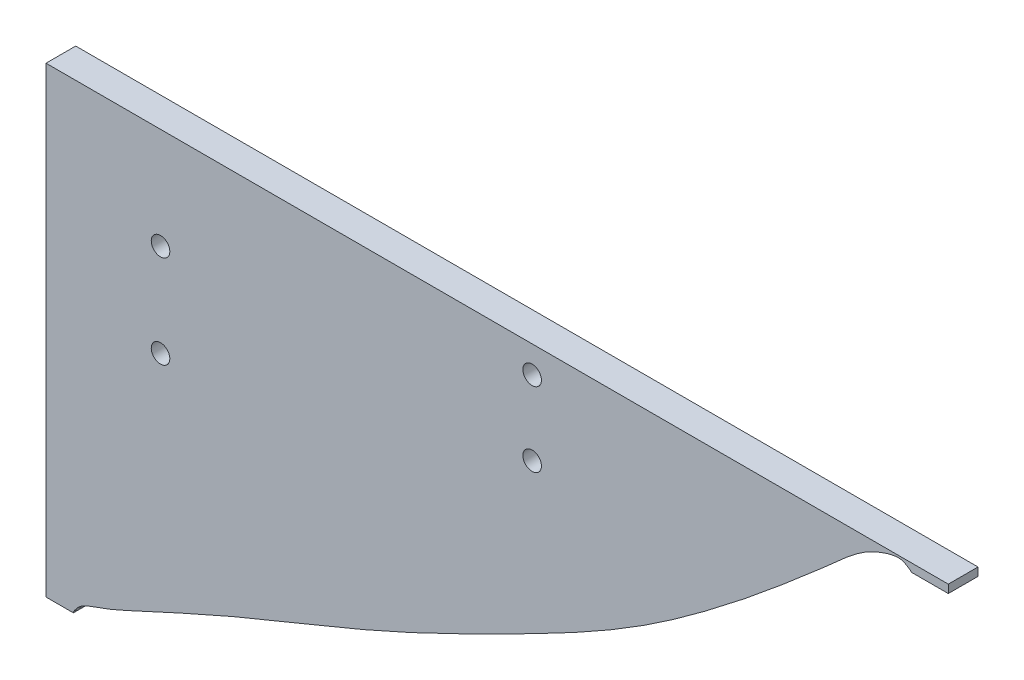
ISO-10303-21;
HEADER;
FILE_DESCRIPTION(('STEP AP214'),'2;1');
FILE_NAME('part.step','',(''),(''),'','','');
FILE_SCHEMA(('AUTOMOTIVE_DESIGN { 1 0 10303 214 1 1 1 1 }'));
ENDSEC;
DATA;
#1=APPLICATION_CONTEXT('core data for automotive mechanical design processes');
#2=APPLICATION_PROTOCOL_DEFINITION('international standard','automotive_design',2000,#1);
#3=PRODUCT_CONTEXT('',#1,'mechanical');
#4=PRODUCT('Part','Part','',(#3));
#5=PRODUCT_RELATED_PRODUCT_CATEGORY('part','',(#4));
#6=PRODUCT_DEFINITION_FORMATION('','',#4);
#7=PRODUCT_DEFINITION_CONTEXT('part definition',#1,'design');
#8=PRODUCT_DEFINITION('design','',#6,#7);
#9=PRODUCT_DEFINITION_SHAPE('','',#8);
#10=(LENGTH_UNIT() NAMED_UNIT(*) SI_UNIT(.MILLI.,.METRE.));
#11=(NAMED_UNIT(*) PLANE_ANGLE_UNIT() SI_UNIT($,.RADIAN.));
#12=(NAMED_UNIT(*) SI_UNIT($,.STERADIAN.) SOLID_ANGLE_UNIT());
#13=UNCERTAINTY_MEASURE_WITH_UNIT(LENGTH_MEASURE(1.E-05),#10,'distance_accuracy_value','');
#14=(GEOMETRIC_REPRESENTATION_CONTEXT(3) GLOBAL_UNCERTAINTY_ASSIGNED_CONTEXT((#13)) GLOBAL_UNIT_ASSIGNED_CONTEXT((#10,
#11,#12)) REPRESENTATION_CONTEXT('',''));
#15=CARTESIAN_POINT('',(0.,0.,0.));
#16=DIRECTION('',(0.,0.,1.));
#17=DIRECTION('',(1.,0.,0.));
#18=AXIS2_PLACEMENT_3D('',#15,#16,#17);
#19=CARTESIAN_POINT('',(-127.147291570498,-122.242162943717,116.));
#20=DIRECTION('',(0.,0.,-1.));
#21=DIRECTION('',(-1.,0.,0.));
#22=AXIS2_PLACEMENT_3D('',#19,#20,#21);
#23=PLANE('',#22);
#24=CARTESIAN_POINT('',(-100.,-50.,116.));
#25=DIRECTION('',(0.,0.,-1.));
#26=DIRECTION('',(-1.,0.,0.));
#27=AXIS2_PLACEMENT_3D('',#24,#25,#26);
#28=CIRCLE('',#27,2.5);
#29=CARTESIAN_POINT('',(-102.5,-50.,116.));
#30=VERTEX_POINT('',#29);
#31=EDGE_CURVE('E207',#30,#30,#28,.F.);
#32=ORIENTED_EDGE('',*,*,#31,.F.);
#33=EDGE_LOOP('',(#32));
#34=FACE_BOUND('',#33,.T.);
#35=CARTESIAN_POINT('',(0.0705666698621599,-4.96037406111782,116.));
#36=DIRECTION('',(0.,0.,-1.));
#37=DIRECTION('',(-1.,0.,0.));
#38=AXIS2_PLACEMENT_3D('',#35,#36,#37);
#39=CIRCLE('',#38,2.5);
#40=CARTESIAN_POINT('',(-2.42943333013784,-4.96037406111782,116.));
#41=VERTEX_POINT('',#40);
#42=EDGE_CURVE('E203',#41,#41,#39,.F.);
#43=ORIENTED_EDGE('',*,*,#42,.F.);
#44=EDGE_LOOP('',(#43));
#45=FACE_BOUND('',#44,.T.);
#46=CARTESIAN_POINT('',(-123.458051920499,-122.239231143203,116.));
#47=CARTESIAN_POINT('',(-125.917545011529,-122.241196913194,116.));
#48=CARTESIAN_POINT('',(-128.377038121611,-122.243138904534,116.));
#49=CARTESIAN_POINT('',(-130.836531244067,-122.245064953348,116.));
#50=B_SPLINE_CURVE_WITH_KNOTS('',3,(#46,#47,#48,#49),.UNSPECIFIED.,.F.,.F.,(4,4),(0.,1.),.UNSPECIFIED.);
#51=CARTESIAN_POINT('',(-130.836531244067,-122.245064953348,116.));
#52=VERTEX_POINT('',#51);
#53=CARTESIAN_POINT('',(-123.458051920499,-122.239231143203,116.));
#54=VERTEX_POINT('',#53);
#55=EDGE_CURVE('E161',#52,#54,#50,.F.);
#56=ORIENTED_EDGE('',*,*,#55,.T.);
#57=CARTESIAN_POINT('',(102.185345036779,0.050501234881916,116.));
#58=CARTESIAN_POINT('',(102.143745349932,0.126282884014848,116.));
#59=CARTESIAN_POINT('',(102.090021150855,0.196170965768959,116.));
#60=CARTESIAN_POINT('',(101.969436927359,0.319138158462939,116.));
#61=CARTESIAN_POINT('',(101.90185150842,0.374024602398633,116.));
#62=CARTESIAN_POINT('',(101.691728117572,0.527497028765685,116.));
#63=CARTESIAN_POINT('',(101.543963902861,0.617815117095939,116.));
#64=CARTESIAN_POINT('',(101.250952529474,0.802382165353212,116.));
#65=CARTESIAN_POINT('',(101.106564648327,0.897973053941049,116.));
#66=CARTESIAN_POINT('',(100.812997731568,1.08167251338324,116.));
#67=CARTESIAN_POINT('',(100.663092856788,1.16969331026808,116.));
#68=CARTESIAN_POINT('',(100.35814206929,1.33127826092675,116.));
#69=CARTESIAN_POINT('',(100.203147888116,1.40486745874551,116.));
#70=CARTESIAN_POINT('',(99.8834987997031,1.52441792114301,116.));
#71=CARTESIAN_POINT('',(99.7189856179253,1.57078449496892,116.));
#72=CARTESIAN_POINT('',(99.381219642386,1.63852392943911,116.));
#73=CARTESIAN_POINT('',(99.2067886348991,1.65986740854222,116.));
#74=CARTESIAN_POINT('',(98.862192139404,1.68212402659577,116.));
#75=CARTESIAN_POINT('',(98.6907385145854,1.68341684615452,116.));
#76=CARTESIAN_POINT('',(98.1781310954065,1.66687661819945,116.));
#77=CARTESIAN_POINT('',(97.8387499509134,1.62840136633339,116.));
#78=CARTESIAN_POINT('',(97.1622460551872,1.52515225956688,116.));
#79=CARTESIAN_POINT('',(96.8245343617113,1.45788547518486,116.));
#80=CARTESIAN_POINT('',(95.8207026316839,1.21663732005597,116.));
#81=CARTESIAN_POINT('',(95.1658503428321,1.00874959833609,116.));
#82=CARTESIAN_POINT('',(93.870659069786,0.545445519335014,116.));
#83=CARTESIAN_POINT('',(93.2354848974096,0.287051757659186,116.));
#84=CARTESIAN_POINT('',(91.995707034373,-0.26970774245057,116.));
#85=CARTESIAN_POINT('',(91.3892460824492,-0.568625422063785,116.));
#86=CARTESIAN_POINT('',(90.2030389733848,-1.20732073118557,116.));
#87=CARTESIAN_POINT('',(89.6234372801556,-1.54731931646892,116.));
#88=CARTESIAN_POINT('',(88.4915687955719,-2.26912488309681,116.));
#89=CARTESIAN_POINT('',(87.9394637325724,-2.65117922597023,116.));
#90=CARTESIAN_POINT('',(86.3147313850487,-3.84564782199919,116.));
#91=CARTESIAN_POINT('',(85.2735731207714,-4.70619355439569,116.));
#92=CARTESIAN_POINT('',(83.2252662085998,-6.47930230895787,116.));
#93=CARTESIAN_POINT('',(82.2185294791051,-7.39142836707141,116.));
#94=CARTESIAN_POINT('',(80.1939705981187,-9.19925463389272,116.));
#95=CARTESIAN_POINT('',(79.1777487698858,-10.0986552179806,116.));
#96=CARTESIAN_POINT('',(77.1264611270884,-11.8758871181459,116.));
#97=CARTESIAN_POINT('',(76.0911317363368,-12.7534177083032,116.));
#98=CARTESIAN_POINT('',(74.0164254108522,-14.5038419680243,116.));
#99=CARTESIAN_POINT('',(72.9792610716652,-15.3792729114846,116.));
#100=CARTESIAN_POINT('',(70.9298028259996,-17.1589552964569,116.));
#101=CARTESIAN_POINT('',(69.9142921010426,-18.0594790058551,116.));
#102=CARTESIAN_POINT('',(67.8646878768501,-19.8389922271503,116.));
#103=CARTESIAN_POINT('',(66.8296633927954,-20.7167304284747,116.));
#104=CARTESIAN_POINT('',(64.7507484383428,-22.4614612861034,116.));
#105=CARTESIAN_POINT('',(63.7080308601868,-23.329934736966,116.));
#106=CARTESIAN_POINT('',(58.4774582845353,-27.652025312593,116.));
#107=CARTESIAN_POINT('',(54.2223472944778,-31.0260193511005,116.));
#108=CARTESIAN_POINT('',(47.7568208587066,-35.9675165786623,116.));
#109=CARTESIAN_POINT('',(45.5874373784499,-37.5945883155184,116.));
#110=CARTESIAN_POINT('',(41.2140181909527,-40.799724049673,116.));
#111=CARTESIAN_POINT('',(39.0094266361723,-42.3770019263137,116.));
#112=CARTESIAN_POINT('',(34.5486967430989,-45.45865641,116.));
#113=CARTESIAN_POINT('',(32.293587444536,-46.9644883610587,116.));
#114=CARTESIAN_POINT('',(27.7320874646265,-49.9036263429001,116.));
#115=CARTESIAN_POINT('',(25.4241743765563,-51.33763013415,116.));
#116=CARTESIAN_POINT('',(20.7677661619923,-54.1312823015686,116.));
#117=CARTESIAN_POINT('',(18.4193127756458,-55.4909221274922,116.));
#118=CARTESIAN_POINT('',(13.6881990605754,-58.1473833366058,116.));
#119=CARTESIAN_POINT('',(11.3055607799984,-59.4442452095373,116.));
#120=CARTESIAN_POINT('',(6.51660243792351,-61.9944791695494,116.));
#121=CARTESIAN_POINT('',(4.11056529690311,-63.2483708185253,116.));
#122=CARTESIAN_POINT('',(-0.709901700973838,-65.7407415334606,116.));
#123=CARTESIAN_POINT('',(-3.12500143561241,-66.9779904199252,116.));
#124=CARTESIAN_POINT('',(-10.3856486991802,-70.6615515374579,116.));
#125=CARTESIAN_POINT('',(-15.2427175398577,-73.081213562781,116.));
#126=CARTESIAN_POINT('',(-24.9936617622751,-77.837659184411,116.));
#127=CARTESIAN_POINT('',(-29.8877650728106,-80.1744152819605,116.));
#128=CARTESIAN_POINT('',(-37.2827989415143,-83.5596333145429,116.));
#129=CARTESIAN_POINT('',(-39.7577998209799,-84.6658058957321,116.));
#130=CARTESIAN_POINT('',(-44.7291972754296,-86.8305315165229,116.));
#131=CARTESIAN_POINT('',(-47.2248287239943,-87.8907874673155,116.));
#132=CARTESIAN_POINT('',(-54.7305215827917,-91.0297162228649,116.));
#133=CARTESIAN_POINT('',(-59.7598500463873,-93.0655071195247,116.));
#134=CARTESIAN_POINT('',(-69.8106978110577,-97.1544694527341,116.));
#135=CARTESIAN_POINT('',(-74.8309952591007,-99.2096397295397,116.));
#136=CARTESIAN_POINT('',(-84.8113629379097,-103.461861537504,116.));
#137=CARTESIAN_POINT('',(-89.7687044749324,-105.66567392611,116.));
#138=CARTESIAN_POINT('',(-97.1769308519184,-109.031772943947,116.));
#139=CARTESIAN_POINT('',(-99.6417859260494,-110.1638227246,116.));
#140=CARTESIAN_POINT('',(-103.337785946255,-111.864632044421,116.));
#141=CARTESIAN_POINT('',(-104.569714817283,-112.431723356779,116.));
#142=CARTESIAN_POINT('',(-107.034353984342,-113.564204573108,116.));
#143=CARTESIAN_POINT('',(-108.266016475275,-114.131945714388,116.));
#144=CARTESIAN_POINT('',(-110.736567108815,-115.251305752162,116.));
#145=CARTESIAN_POINT('',(-111.977221460794,-115.800163082338,116.));
#146=CARTESIAN_POINT('',(-113.855728193572,-116.579265004338,116.));
#147=CARTESIAN_POINT('',(-114.48476765908,-116.831597669714,116.));
#148=CARTESIAN_POINT('',(-115.751244101855,-117.314708747659,116.));
#149=CARTESIAN_POINT('',(-116.389780655786,-117.542664829749,116.));
#150=CARTESIAN_POINT('',(-117.67165600791,-117.986250868068,116.));
#151=CARTESIAN_POINT('',(-118.313411152534,-118.205945655686,116.));
#152=CARTESIAN_POINT('',(-119.262221286969,-118.570966851158,116.));
#153=CARTESIAN_POINT('',(-119.576462069353,-118.697849177697,116.));
#154=CARTESIAN_POINT('',(-120.196857346799,-118.972369250501,116.));
#155=CARTESIAN_POINT('',(-120.504121011376,-119.120447972246,116.));
#156=CARTESIAN_POINT('',(-121.095592759326,-119.449584033694,116.));
#157=CARTESIAN_POINT('',(-121.380303340259,-119.630761690681,116.));
#158=CARTESIAN_POINT('',(-121.915930532508,-120.044027688222,116.));
#159=CARTESIAN_POINT('',(-122.165530639422,-120.281213246816,116.));
#160=CARTESIAN_POINT('',(-122.618207207597,-120.786374644734,116.));
#161=CARTESIAN_POINT('',(-122.825015212994,-121.05474960064,116.));
#162=CARTESIAN_POINT('',(-123.11963290276,-121.469923256004,116.));
#163=CARTESIAN_POINT('',(-123.217963014272,-121.609674035666,116.));
#164=CARTESIAN_POINT('',(-123.342884404126,-121.832447477953,116.));
#165=CARTESIAN_POINT('',(-123.380001259822,-121.908782181737,116.));
#166=CARTESIAN_POINT('',(-123.436207004498,-122.069728633116,116.));
#167=CARTESIAN_POINT('',(-123.454774335715,-122.154391049123,116.));
#168=CARTESIAN_POINT('',(-123.458051920499,-122.239231143203,116.));
#169=B_SPLINE_CURVE_WITH_KNOTS('',3,(#57,#58,#59,#60,#61,#62,#63,#64,#65,#66,#67,#68,#69,#70,
#71,#72,#73,#74,#75,#76,#77,#78,#79,#80,#81,#82,#83,#84,#85,#86,#87,#88,#89,#90,#91,#92,#93,#94,
#95,#96,#97,#98,#99,#100,#101,#102,#103,#104,#105,#106,#107,#108,#109,#110,#111,#112,#113,#114,
#115,#116,#117,#118,#119,#120,#121,#122,#123,#124,#125,#126,#127,#128,#129,#130,#131,#132,#133,
#134,#135,#136,#137,#138,#139,#140,#141,#142,#143,#144,#145,#146,#147,#148,#149,#150,#151,#152,
#153,#154,#155,#156,#157,#158,#159,#160,#161,#162,#163,#164,#165,#166,#167,#168),.UNSPECIFIED.,
.F.,.F.,(4,2,2,2,2,2,2,2,2,2,2,2,2,2,2,2,2,2,2,2,2,2,2,2,2,2,2,2,2,2,2,2,2,2,2,2,2,2,2,2,2,2,2,
2,2,2,2,2,2,2,2,2,2,2,2,4),(0.,0.000976562499999889,0.00195312499999978,0.00390624999999989,
0.00585937499999989,0.0078125,0.009765625,0.01171875,0.0136718750000001,0.0156250000000001,
0.01953125,0.0234374999999999,0.0312499999999999,0.0390624999999998,0.0468749999999998,
0.0546874999999998,0.0624999999999997,0.0781249999999996,0.0937499999999996,0.109374999999999,
0.124999999999999,0.140624999999999,0.156249999999999,0.171874999999999,0.187499999999999,
0.249999999999999,0.281249999999999,0.3125,0.34375,0.375,0.40625,0.437499999999999,
0.468749999999999,0.499999999999999,0.562499999999999,0.624999999999999,0.656249999999999,
0.687499999999999,0.75,0.8125,0.875,0.90625,0.921875,0.9375,0.953125,0.9609375,0.96875,
0.9765625,0.98046875,0.984375,0.98828125,0.9921875,0.99609375,0.998046875,0.9990234375,1.),.UNSPECIFIED.);
#170=CARTESIAN_POINT('',(102.185345036779,0.050501234881916,116.));
#171=VERTEX_POINT('',#170);
#172=EDGE_CURVE('E88',#54,#171,#169,.F.);
#173=ORIENTED_EDGE('',*,*,#172,.T.);
#174=DIRECTION('',(0.999999999820266,1.89596216249227E-05,0.));
#175=VECTOR('',#174,1.);
#176=CARTESIAN_POINT('',(102.185345036779,0.0505012348819037,116.));
#177=LINE('',#176,#175);
#178=CARTESIAN_POINT('',(112.12090684944,0.0506896093745366,116.));
#179=VERTEX_POINT('',#178);
#180=EDGE_CURVE('E102',#171,#179,#177,.T.);
#181=ORIENTED_EDGE('',*,*,#180,.T.);
#182=DIRECTION('',(0.,1.,0.));
#183=VECTOR('',#182,1.);
#184=CARTESIAN_POINT('',(112.12090684944,2.25600000000004,116.));
#185=LINE('',#184,#183);
#186=CARTESIAN_POINT('',(112.12090684944,2.25600000000004,116.));
#187=VERTEX_POINT('',#186);
#188=EDGE_CURVE('E96',#179,#187,#185,.T.);
#189=ORIENTED_EDGE('',*,*,#188,.T.);
#190=DIRECTION('',(-1.,0.,0.));
#191=VECTOR('',#190,1.);
#192=CARTESIAN_POINT('',(112.12090684944,2.25600000000004,116.));
#193=LINE('',#192,#191);
#194=CARTESIAN_POINT('',(-130.836531244067,2.25600000000001,116.));
#195=VERTEX_POINT('',#194);
#196=EDGE_CURVE('E100',#187,#195,#193,.T.);
#197=ORIENTED_EDGE('',*,*,#196,.T.);
#198=DIRECTION('',(0.,-1.,0.));
#199=VECTOR('',#198,1.);
#200=CARTESIAN_POINT('',(-130.836531244067,-122.245064953348,116.));
#201=LINE('',#200,#199);
#202=EDGE_CURVE('E51',#195,#52,#201,.T.);
#203=ORIENTED_EDGE('',*,*,#202,.T.);
#204=EDGE_LOOP('',(#56,#173,#181,#189,#197,#203));
#205=FACE_BOUND('',#204,.T.);
#206=CARTESIAN_POINT('',(0.0705666698621599,-25.,116.));
#207=DIRECTION('',(0.,0.,-1.));
#208=DIRECTION('',(-1.,0.,0.));
#209=AXIS2_PLACEMENT_3D('',#206,#207,#208);
#210=CIRCLE('',#209,2.5);
#211=CARTESIAN_POINT('',(-2.42943333013784,-25.,116.));
#212=VERTEX_POINT('',#211);
#213=EDGE_CURVE('E204',#212,#212,#210,.F.);
#214=ORIENTED_EDGE('',*,*,#213,.F.);
#215=EDGE_LOOP('',(#214));
#216=FACE_BOUND('',#215,.T.);
#217=CARTESIAN_POINT('',(-100.,-25.,116.));
#218=DIRECTION('',(0.,0.,-1.));
#219=DIRECTION('',(-1.,0.,0.));
#220=AXIS2_PLACEMENT_3D('',#217,#218,#219);
#221=CIRCLE('',#220,2.5);
#222=CARTESIAN_POINT('',(-102.5,-25.,116.));
#223=VERTEX_POINT('',#222);
#224=EDGE_CURVE('E210',#223,#223,#221,.F.);
#225=ORIENTED_EDGE('',*,*,#224,.F.);
#226=EDGE_LOOP('',(#225));
#227=FACE_BOUND('',#226,.T.);
#228=ADVANCED_FACE('F30',(#34,#45,#205,#216,#227),#23,.F.);
#229=CARTESIAN_POINT('',(-127.147291570498,-122.242162943717,108.));
#230=DIRECTION('',(0.,0.,-1.));
#231=DIRECTION('',(-1.,0.,0.));
#232=AXIS2_PLACEMENT_3D('',#229,#230,#231);
#233=PLANE('',#232);
#234=CARTESIAN_POINT('',(-100.,-50.,108.));
#235=DIRECTION('',(0.,0.,-1.));
#236=DIRECTION('',(-1.,0.,0.));
#237=AXIS2_PLACEMENT_3D('',#234,#235,#236);
#238=CIRCLE('',#237,2.5);
#239=CARTESIAN_POINT('',(-102.5,-50.,108.));
#240=VERTEX_POINT('',#239);
#241=EDGE_CURVE('E208',#240,#240,#238,.F.);
#242=ORIENTED_EDGE('',*,*,#241,.T.);
#243=EDGE_LOOP('',(#242));
#244=FACE_BOUND('',#243,.T.);
#245=CARTESIAN_POINT('',(0.0705666698621599,-4.96037406111782,108.));
#246=DIRECTION('',(0.,0.,-1.));
#247=DIRECTION('',(-1.,0.,0.));
#248=AXIS2_PLACEMENT_3D('',#245,#246,#247);
#249=CIRCLE('',#248,2.5);
#250=CARTESIAN_POINT('',(-2.42943333013784,-4.96037406111782,108.));
#251=VERTEX_POINT('',#250);
#252=EDGE_CURVE('E200',#251,#251,#249,.F.);
#253=ORIENTED_EDGE('',*,*,#252,.T.);
#254=EDGE_LOOP('',(#253));
#255=FACE_BOUND('',#254,.T.);
#256=CARTESIAN_POINT('',(-130.836531244067,-122.245064953348,108.));
#257=CARTESIAN_POINT('',(-128.377038121611,-122.243138904534,108.));
#258=CARTESIAN_POINT('',(-125.917545011529,-122.241196913194,108.));
#259=CARTESIAN_POINT('',(-123.458051920499,-122.239231143203,108.));
#260=B_SPLINE_CURVE_WITH_KNOTS('',3,(#256,#257,#258,#259),.UNSPECIFIED.,.F.,.F.,(4,4),(0.,1.),.UNSPECIFIED.);
#261=CARTESIAN_POINT('',(-130.836531244067,-122.245064953348,108.));
#262=VERTEX_POINT('',#261);
#263=CARTESIAN_POINT('',(-123.458051920499,-122.239231143203,108.));
#264=VERTEX_POINT('',#263);
#265=EDGE_CURVE('E178',#262,#264,#260,.T.);
#266=ORIENTED_EDGE('',*,*,#265,.F.);
#267=DIRECTION('',(0.,-1.,0.));
#268=VECTOR('',#267,1.);
#269=CARTESIAN_POINT('',(-130.836531244067,-122.245064953348,108.));
#270=LINE('',#269,#268);
#271=CARTESIAN_POINT('',(-130.836531244067,2.25600000000001,108.));
#272=VERTEX_POINT('',#271);
#273=EDGE_CURVE('E80',#272,#262,#270,.T.);
#274=ORIENTED_EDGE('',*,*,#273,.F.);
#275=DIRECTION('',(-1.,0.,0.));
#276=VECTOR('',#275,1.);
#277=CARTESIAN_POINT('',(112.12090684944,2.25600000000004,108.));
#278=LINE('',#277,#276);
#279=CARTESIAN_POINT('',(112.12090684944,2.25600000000004,108.));
#280=VERTEX_POINT('',#279);
#281=EDGE_CURVE('E74',#280,#272,#278,.T.);
#282=ORIENTED_EDGE('',*,*,#281,.F.);
#283=DIRECTION('',(0.,1.,0.));
#284=VECTOR('',#283,1.);
#285=CARTESIAN_POINT('',(112.12090684944,2.25600000000004,108.));
#286=LINE('',#285,#284);
#287=CARTESIAN_POINT('',(112.12090684944,0.0506896093745366,108.));
#288=VERTEX_POINT('',#287);
#289=EDGE_CURVE('E110',#288,#280,#286,.T.);
#290=ORIENTED_EDGE('',*,*,#289,.F.);
#291=DIRECTION('',(0.999999999820266,1.89596216249227E-05,0.));
#292=VECTOR('',#291,1.);
#293=CARTESIAN_POINT('',(102.185345036779,0.0505012348819037,108.));
#294=LINE('',#293,#292);
#295=CARTESIAN_POINT('',(102.185345036779,0.050501234881916,108.));
#296=VERTEX_POINT('',#295);
#297=EDGE_CURVE('E121',#296,#288,#294,.T.);
#298=ORIENTED_EDGE('',*,*,#297,.F.);
#299=CARTESIAN_POINT('',(-123.458051920499,-122.239231143203,108.));
#300=CARTESIAN_POINT('',(-123.454774335715,-122.154391049123,108.));
#301=CARTESIAN_POINT('',(-123.436207004498,-122.069728633116,108.));
#302=CARTESIAN_POINT('',(-123.380001259822,-121.908782181737,108.));
#303=CARTESIAN_POINT('',(-123.342884404126,-121.832447477953,108.));
#304=CARTESIAN_POINT('',(-123.217963014272,-121.609674035666,108.));
#305=CARTESIAN_POINT('',(-123.11963290276,-121.469923256004,108.));
#306=CARTESIAN_POINT('',(-122.825015212994,-121.05474960064,108.));
#307=CARTESIAN_POINT('',(-122.618207207597,-120.786374644734,108.));
#308=CARTESIAN_POINT('',(-122.165530639422,-120.281213246816,108.));
#309=CARTESIAN_POINT('',(-121.915930532508,-120.044027688222,108.));
#310=CARTESIAN_POINT('',(-121.380303340259,-119.630761690681,108.));
#311=CARTESIAN_POINT('',(-121.095592759326,-119.449584033694,108.));
#312=CARTESIAN_POINT('',(-120.504121011376,-119.120447972246,108.));
#313=CARTESIAN_POINT('',(-120.196857346799,-118.972369250501,108.));
#314=CARTESIAN_POINT('',(-119.576462069353,-118.697849177697,108.));
#315=CARTESIAN_POINT('',(-119.262221286969,-118.570966851158,108.));
#316=CARTESIAN_POINT('',(-118.313411152534,-118.205945655686,108.));
#317=CARTESIAN_POINT('',(-117.67165600791,-117.986250868068,108.));
#318=CARTESIAN_POINT('',(-116.389780655786,-117.542664829749,108.));
#319=CARTESIAN_POINT('',(-115.751244101855,-117.314708747659,108.));
#320=CARTESIAN_POINT('',(-114.48476765908,-116.831597669714,108.));
#321=CARTESIAN_POINT('',(-113.855728193572,-116.579265004338,108.));
#322=CARTESIAN_POINT('',(-111.977221460794,-115.800163082338,108.));
#323=CARTESIAN_POINT('',(-110.736567108815,-115.251305752162,108.));
#324=CARTESIAN_POINT('',(-108.266016475275,-114.131945714388,108.));
#325=CARTESIAN_POINT('',(-107.034353984342,-113.564204573108,108.));
#326=CARTESIAN_POINT('',(-104.569714817283,-112.431723356779,108.));
#327=CARTESIAN_POINT('',(-103.337785946255,-111.864632044421,108.));
#328=CARTESIAN_POINT('',(-99.6417859260494,-110.1638227246,108.));
#329=CARTESIAN_POINT('',(-97.1769308519184,-109.031772943947,108.));
#330=CARTESIAN_POINT('',(-89.7687044749324,-105.66567392611,108.));
#331=CARTESIAN_POINT('',(-84.8113629379097,-103.461861537504,108.));
#332=CARTESIAN_POINT('',(-74.8309952591007,-99.2096397295397,108.));
#333=CARTESIAN_POINT('',(-69.8106978110577,-97.1544694527341,108.));
#334=CARTESIAN_POINT('',(-59.7598500463873,-93.0655071195247,108.));
#335=CARTESIAN_POINT('',(-54.7305215827917,-91.0297162228649,108.));
#336=CARTESIAN_POINT('',(-47.2248287239943,-87.8907874673155,108.));
#337=CARTESIAN_POINT('',(-44.7291972754296,-86.8305315165229,108.));
#338=CARTESIAN_POINT('',(-39.7577998209799,-84.6658058957321,108.));
#339=CARTESIAN_POINT('',(-37.2827989415143,-83.5596333145429,108.));
#340=CARTESIAN_POINT('',(-29.8877650728106,-80.1744152819605,108.));
#341=CARTESIAN_POINT('',(-24.9936617622751,-77.837659184411,108.));
#342=CARTESIAN_POINT('',(-15.2427175398577,-73.081213562781,108.));
#343=CARTESIAN_POINT('',(-10.3856486991802,-70.6615515374579,108.));
#344=CARTESIAN_POINT('',(-3.12500143561241,-66.9779904199252,108.));
#345=CARTESIAN_POINT('',(-0.709901700973838,-65.7407415334606,108.));
#346=CARTESIAN_POINT('',(4.11056529690311,-63.2483708185253,108.));
#347=CARTESIAN_POINT('',(6.51660243792351,-61.9944791695494,108.));
#348=CARTESIAN_POINT('',(11.3055607799984,-59.4442452095373,108.));
#349=CARTESIAN_POINT('',(13.6881990605754,-58.1473833366058,108.));
#350=CARTESIAN_POINT('',(18.4193127756458,-55.4909221274922,108.));
#351=CARTESIAN_POINT('',(20.7677661619923,-54.1312823015686,108.));
#352=CARTESIAN_POINT('',(25.4241743765563,-51.33763013415,108.));
#353=CARTESIAN_POINT('',(27.7320874646265,-49.9036263429001,108.));
#354=CARTESIAN_POINT('',(32.293587444536,-46.9644883610587,108.));
#355=CARTESIAN_POINT('',(34.5486967430989,-45.45865641,108.));
#356=CARTESIAN_POINT('',(39.0094266361723,-42.3770019263137,108.));
#357=CARTESIAN_POINT('',(41.2140181909527,-40.799724049673,108.));
#358=CARTESIAN_POINT('',(45.5874373784499,-37.5945883155184,108.));
#359=CARTESIAN_POINT('',(47.7568208587066,-35.9675165786623,108.));
#360=CARTESIAN_POINT('',(54.2223472944778,-31.0260193511005,108.));
#361=CARTESIAN_POINT('',(58.4774582845353,-27.652025312593,108.));
#362=CARTESIAN_POINT('',(63.7080308601868,-23.329934736966,108.));
#363=CARTESIAN_POINT('',(64.7507484383428,-22.4614612861034,108.));
#364=CARTESIAN_POINT('',(66.8296633927954,-20.7167304284747,108.));
#365=CARTESIAN_POINT('',(67.8646878768501,-19.8389922271503,108.));
#366=CARTESIAN_POINT('',(69.9142921010426,-18.0594790058551,108.));
#367=CARTESIAN_POINT('',(70.9298028259996,-17.1589552964569,108.));
#368=CARTESIAN_POINT('',(72.9792610716652,-15.3792729114846,108.));
#369=CARTESIAN_POINT('',(74.0164254108522,-14.5038419680243,108.));
#370=CARTESIAN_POINT('',(76.0911317363368,-12.7534177083032,108.));
#371=CARTESIAN_POINT('',(77.1264611270884,-11.8758871181459,108.));
#372=CARTESIAN_POINT('',(79.1777487698858,-10.0986552179806,108.));
#373=CARTESIAN_POINT('',(80.1939705981187,-9.19925463389272,108.));
#374=CARTESIAN_POINT('',(82.2185294791051,-7.39142836707141,108.));
#375=CARTESIAN_POINT('',(83.2252662085998,-6.47930230895787,108.));
#376=CARTESIAN_POINT('',(85.2735731207714,-4.70619355439569,108.));
#377=CARTESIAN_POINT('',(86.3147313850487,-3.84564782199919,108.));
#378=CARTESIAN_POINT('',(87.9394637325724,-2.65117922597023,108.));
#379=CARTESIAN_POINT('',(88.4915687955719,-2.26912488309681,108.));
#380=CARTESIAN_POINT('',(89.6234372801556,-1.54731931646892,108.));
#381=CARTESIAN_POINT('',(90.2030389733848,-1.20732073118557,108.));
#382=CARTESIAN_POINT('',(91.3892460824492,-0.568625422063785,108.));
#383=CARTESIAN_POINT('',(91.995707034373,-0.26970774245057,108.));
#384=CARTESIAN_POINT('',(93.2354848974096,0.287051757659186,108.));
#385=CARTESIAN_POINT('',(93.870659069786,0.545445519335014,108.));
#386=CARTESIAN_POINT('',(95.1658503428321,1.00874959833609,108.));
#387=CARTESIAN_POINT('',(95.8207026316839,1.21663732005597,108.));
#388=CARTESIAN_POINT('',(96.8245343617113,1.45788547518486,108.));
#389=CARTESIAN_POINT('',(97.1622460551872,1.52515225956688,108.));
#390=CARTESIAN_POINT('',(97.8387499509134,1.62840136633339,108.));
#391=CARTESIAN_POINT('',(98.1781310954065,1.66687661819945,108.));
#392=CARTESIAN_POINT('',(98.6907385145854,1.68341684615452,108.));
#393=CARTESIAN_POINT('',(98.862192139404,1.68212402659577,108.));
#394=CARTESIAN_POINT('',(99.2067886348991,1.65986740854222,108.));
#395=CARTESIAN_POINT('',(99.381219642386,1.63852392943911,108.));
#396=CARTESIAN_POINT('',(99.7189856179253,1.57078449496892,108.));
#397=CARTESIAN_POINT('',(99.8834987997031,1.52441792114301,108.));
#398=CARTESIAN_POINT('',(100.203147888116,1.40486745874551,108.));
#399=CARTESIAN_POINT('',(100.35814206929,1.33127826092675,108.));
#400=CARTESIAN_POINT('',(100.663092856788,1.16969331026808,108.));
#401=CARTESIAN_POINT('',(100.812997731568,1.08167251338324,108.));
#402=CARTESIAN_POINT('',(101.106564648327,0.897973053941049,108.));
#403=CARTESIAN_POINT('',(101.250952529474,0.802382165353212,108.));
#404=CARTESIAN_POINT('',(101.543963902861,0.617815117095939,108.));
#405=CARTESIAN_POINT('',(101.691728117572,0.527497028765685,108.));
#406=CARTESIAN_POINT('',(101.90185150842,0.374024602398633,108.));
#407=CARTESIAN_POINT('',(101.969436927359,0.319138158462939,108.));
#408=CARTESIAN_POINT('',(102.090021150855,0.196170965768959,108.));
#409=CARTESIAN_POINT('',(102.143745349932,0.126282884014848,108.));
#410=CARTESIAN_POINT('',(102.185345036779,0.050501234881916,108.));
#411=B_SPLINE_CURVE_WITH_KNOTS('',3,(#299,#300,#301,#302,#303,#304,#305,#306,#307,#308,#309,
#310,#311,#312,#313,#314,#315,#316,#317,#318,#319,#320,#321,#322,#323,#324,#325,#326,#327,#328,
#329,#330,#331,#332,#333,#334,#335,#336,#337,#338,#339,#340,#341,#342,#343,#344,#345,#346,#347,
#348,#349,#350,#351,#352,#353,#354,#355,#356,#357,#358,#359,#360,#361,#362,#363,#364,#365,#366,
#367,#368,#369,#370,#371,#372,#373,#374,#375,#376,#377,#378,#379,#380,#381,#382,#383,#384,#385,
#386,#387,#388,#389,#390,#391,#392,#393,#394,#395,#396,#397,#398,#399,#400,#401,#402,#403,#404,
#405,#406,#407,#408,#409,#410),.UNSPECIFIED.,.F.,.F.,(4,2,2,2,2,2,2,2,2,2,2,2,2,2,2,2,2,2,2,2,2,
2,2,2,2,2,2,2,2,2,2,2,2,2,2,2,2,2,2,2,2,2,2,2,2,2,2,2,2,2,2,2,2,2,2,4),(0.,0.000976562500000023,
0.00195312500000005,0.00390625000000015,0.00781250000000014,0.0117187500000001,
0.0156250000000001,0.0195312500000001,0.0234375000000001,0.0312500000000001,0.0390625000000001,
0.0468750000000001,0.0625000000000001,0.0781250000000002,0.0937500000000002,0.125,0.1875,0.25,
0.312500000000001,0.343750000000001,0.375000000000001,0.437500000000001,0.500000000000001,
0.531250000000001,0.562500000000001,0.59375,0.625,0.65625,0.6875,0.718750000000001,
0.750000000000001,0.812500000000001,0.828125000000001,0.843750000000001,0.859375000000001,
0.875000000000001,0.890625000000001,0.90625,0.921875,0.9375,0.9453125,0.953125,0.9609375,
0.96875,0.9765625,0.98046875,0.984375,0.986328125,0.98828125,0.990234375,0.9921875,0.994140625,
0.99609375,0.998046875,0.9990234375,1.),.UNSPECIFIED.);
#412=EDGE_CURVE('E258',#264,#296,#411,.T.);
#413=ORIENTED_EDGE('',*,*,#412,.F.);
#414=EDGE_LOOP('',(#266,#274,#282,#290,#298,#413));
#415=FACE_BOUND('',#414,.T.);
#416=CARTESIAN_POINT('',(0.0705666698621599,-25.,108.));
#417=DIRECTION('',(0.,0.,-1.));
#418=DIRECTION('',(-1.,0.,0.));
#419=AXIS2_PLACEMENT_3D('',#416,#417,#418);
#420=CIRCLE('',#419,2.5);
#421=CARTESIAN_POINT('',(-2.42943333013784,-25.,108.));
#422=VERTEX_POINT('',#421);
#423=EDGE_CURVE('E205',#422,#422,#420,.F.);
#424=ORIENTED_EDGE('',*,*,#423,.T.);
#425=EDGE_LOOP('',(#424));
#426=FACE_BOUND('',#425,.T.);
#427=CARTESIAN_POINT('',(-100.,-25.,108.));
#428=DIRECTION('',(0.,0.,-1.));
#429=DIRECTION('',(-1.,0.,0.));
#430=AXIS2_PLACEMENT_3D('',#427,#428,#429);
#431=CIRCLE('',#430,2.5);
#432=CARTESIAN_POINT('',(-102.5,-25.,108.));
#433=VERTEX_POINT('',#432);
#434=EDGE_CURVE('E36',#433,#433,#431,.F.);
#435=ORIENTED_EDGE('',*,*,#434,.T.);
#436=EDGE_LOOP('',(#435));
#437=FACE_BOUND('',#436,.T.);
#438=ADVANCED_FACE('F139',(#244,#255,#415,#426,#437),#233,.T.);
#439=CARTESIAN_POINT('',(-130.836531244067,-122.245064953348,116.));
#440=CARTESIAN_POINT('',(-128.377038121611,-122.243138904534,116.));
#441=CARTESIAN_POINT('',(-125.917545011529,-122.241196913194,116.));
#442=CARTESIAN_POINT('',(-123.458051920499,-122.239231143203,116.));
#443=B_SPLINE_CURVE_WITH_KNOTS('',3,(#439,#440,#441,#442),.UNSPECIFIED.,.F.,.F.,(4,4),(0.,1.),.UNSPECIFIED.);
#444=DIRECTION('',(0.,0.,-1.));
#445=VECTOR('',#444,1.);
#446=SURFACE_OF_LINEAR_EXTRUSION('',#443,#445);
#447=ORIENTED_EDGE('',*,*,#265,.T.);
#448=DIRECTION('',(0.,0.,-1.));
#449=VECTOR('',#448,1.);
#450=CARTESIAN_POINT('',(-123.458051920499,-122.239231143203,116.));
#451=LINE('',#450,#449);
#452=EDGE_CURVE('E11',#54,#264,#451,.T.);
#453=ORIENTED_EDGE('',*,*,#452,.F.);
#454=ORIENTED_EDGE('',*,*,#55,.F.);
#455=DIRECTION('',(0.,0.,-1.));
#456=VECTOR('',#455,1.);
#457=CARTESIAN_POINT('',(-130.836531244067,-122.245064953348,116.));
#458=LINE('',#457,#456);
#459=EDGE_CURVE('E116',#52,#262,#458,.T.);
#460=ORIENTED_EDGE('',*,*,#459,.T.);
#461=EDGE_LOOP('',(#447,#453,#454,#460));
#462=FACE_BOUND('',#461,.T.);
#463=ADVANCED_FACE('F32',(#462),#446,.F.);
#464=CARTESIAN_POINT('',(-123.458051920499,-122.239231143203,116.));
#465=CARTESIAN_POINT('',(-123.454774335715,-122.154391049123,116.));
#466=CARTESIAN_POINT('',(-123.436207004498,-122.069728633116,116.));
#467=CARTESIAN_POINT('',(-123.380001259822,-121.908782181737,116.));
#468=CARTESIAN_POINT('',(-123.342884404126,-121.832447477953,116.));
#469=CARTESIAN_POINT('',(-123.217963014272,-121.609674035666,116.));
#470=CARTESIAN_POINT('',(-123.11963290276,-121.469923256004,116.));
#471=CARTESIAN_POINT('',(-122.825015212994,-121.05474960064,116.));
#472=CARTESIAN_POINT('',(-122.618207207597,-120.786374644734,116.));
#473=CARTESIAN_POINT('',(-122.165530639422,-120.281213246816,116.));
#474=CARTESIAN_POINT('',(-121.915930532508,-120.044027688222,116.));
#475=CARTESIAN_POINT('',(-121.380303340259,-119.630761690681,116.));
#476=CARTESIAN_POINT('',(-121.095592759326,-119.449584033694,116.));
#477=CARTESIAN_POINT('',(-120.504121011376,-119.120447972246,116.));
#478=CARTESIAN_POINT('',(-120.196857346799,-118.972369250501,116.));
#479=CARTESIAN_POINT('',(-119.576462069353,-118.697849177697,116.));
#480=CARTESIAN_POINT('',(-119.262221286969,-118.570966851158,116.));
#481=CARTESIAN_POINT('',(-118.313411152534,-118.205945655686,116.));
#482=CARTESIAN_POINT('',(-117.67165600791,-117.986250868068,116.));
#483=CARTESIAN_POINT('',(-116.389780655786,-117.542664829749,116.));
#484=CARTESIAN_POINT('',(-115.751244101855,-117.314708747659,116.));
#485=CARTESIAN_POINT('',(-114.48476765908,-116.831597669714,116.));
#486=CARTESIAN_POINT('',(-113.855728193572,-116.579265004338,116.));
#487=CARTESIAN_POINT('',(-111.977221460794,-115.800163082338,116.));
#488=CARTESIAN_POINT('',(-110.736567108815,-115.251305752162,116.));
#489=CARTESIAN_POINT('',(-108.266016475275,-114.131945714388,116.));
#490=CARTESIAN_POINT('',(-107.034353984342,-113.564204573108,116.));
#491=CARTESIAN_POINT('',(-104.569714817283,-112.431723356779,116.));
#492=CARTESIAN_POINT('',(-103.337785946255,-111.864632044421,116.));
#493=CARTESIAN_POINT('',(-99.6417859260494,-110.1638227246,116.));
#494=CARTESIAN_POINT('',(-97.1769308519184,-109.031772943947,116.));
#495=CARTESIAN_POINT('',(-89.7687044749324,-105.66567392611,116.));
#496=CARTESIAN_POINT('',(-84.8113629379097,-103.461861537504,116.));
#497=CARTESIAN_POINT('',(-74.8309952591007,-99.2096397295397,116.));
#498=CARTESIAN_POINT('',(-69.8106978110577,-97.1544694527341,116.));
#499=CARTESIAN_POINT('',(-59.7598500463873,-93.0655071195247,116.));
#500=CARTESIAN_POINT('',(-54.7305215827917,-91.0297162228649,116.));
#501=CARTESIAN_POINT('',(-47.2248287239943,-87.8907874673155,116.));
#502=CARTESIAN_POINT('',(-44.7291972754296,-86.8305315165229,116.));
#503=CARTESIAN_POINT('',(-39.7577998209799,-84.6658058957321,116.));
#504=CARTESIAN_POINT('',(-37.2827989415143,-83.5596333145429,116.));
#505=CARTESIAN_POINT('',(-29.8877650728106,-80.1744152819605,116.));
#506=CARTESIAN_POINT('',(-24.9936617622751,-77.837659184411,116.));
#507=CARTESIAN_POINT('',(-15.2427175398577,-73.081213562781,116.));
#508=CARTESIAN_POINT('',(-10.3856486991802,-70.6615515374579,116.));
#509=CARTESIAN_POINT('',(-3.12500143561241,-66.9779904199252,116.));
#510=CARTESIAN_POINT('',(-0.709901700973838,-65.7407415334606,116.));
#511=CARTESIAN_POINT('',(4.11056529690311,-63.2483708185253,116.));
#512=CARTESIAN_POINT('',(6.51660243792351,-61.9944791695494,116.));
#513=CARTESIAN_POINT('',(11.3055607799984,-59.4442452095373,116.));
#514=CARTESIAN_POINT('',(13.6881990605754,-58.1473833366058,116.));
#515=CARTESIAN_POINT('',(18.4193127756458,-55.4909221274922,116.));
#516=CARTESIAN_POINT('',(20.7677661619923,-54.1312823015686,116.));
#517=CARTESIAN_POINT('',(25.4241743765563,-51.33763013415,116.));
#518=CARTESIAN_POINT('',(27.7320874646265,-49.9036263429001,116.));
#519=CARTESIAN_POINT('',(32.293587444536,-46.9644883610587,116.));
#520=CARTESIAN_POINT('',(34.5486967430989,-45.45865641,116.));
#521=CARTESIAN_POINT('',(39.0094266361723,-42.3770019263137,116.));
#522=CARTESIAN_POINT('',(41.2140181909527,-40.799724049673,116.));
#523=CARTESIAN_POINT('',(45.5874373784499,-37.5945883155184,116.));
#524=CARTESIAN_POINT('',(47.7568208587066,-35.9675165786623,116.));
#525=CARTESIAN_POINT('',(54.2223472944778,-31.0260193511005,116.));
#526=CARTESIAN_POINT('',(58.4774582845353,-27.652025312593,116.));
#527=CARTESIAN_POINT('',(63.7080308601868,-23.329934736966,116.));
#528=CARTESIAN_POINT('',(64.7507484383428,-22.4614612861034,116.));
#529=CARTESIAN_POINT('',(66.8296633927954,-20.7167304284747,116.));
#530=CARTESIAN_POINT('',(67.8646878768501,-19.8389922271503,116.));
#531=CARTESIAN_POINT('',(69.9142921010426,-18.0594790058551,116.));
#532=CARTESIAN_POINT('',(70.9298028259996,-17.1589552964569,116.));
#533=CARTESIAN_POINT('',(72.9792610716652,-15.3792729114846,116.));
#534=CARTESIAN_POINT('',(74.0164254108522,-14.5038419680243,116.));
#535=CARTESIAN_POINT('',(76.0911317363368,-12.7534177083032,116.));
#536=CARTESIAN_POINT('',(77.1264611270884,-11.8758871181459,116.));
#537=CARTESIAN_POINT('',(79.1777487698858,-10.0986552179806,116.));
#538=CARTESIAN_POINT('',(80.1939705981187,-9.19925463389272,116.));
#539=CARTESIAN_POINT('',(82.2185294791051,-7.39142836707141,116.));
#540=CARTESIAN_POINT('',(83.2252662085998,-6.47930230895787,116.));
#541=CARTESIAN_POINT('',(85.2735731207714,-4.70619355439569,116.));
#542=CARTESIAN_POINT('',(86.3147313850487,-3.84564782199919,116.));
#543=CARTESIAN_POINT('',(87.9394637325724,-2.65117922597023,116.));
#544=CARTESIAN_POINT('',(88.4915687955719,-2.26912488309681,116.));
#545=CARTESIAN_POINT('',(89.6234372801556,-1.54731931646892,116.));
#546=CARTESIAN_POINT('',(90.2030389733848,-1.20732073118557,116.));
#547=CARTESIAN_POINT('',(91.3892460824492,-0.568625422063785,116.));
#548=CARTESIAN_POINT('',(91.995707034373,-0.26970774245057,116.));
#549=CARTESIAN_POINT('',(93.2354848974096,0.287051757659186,116.));
#550=CARTESIAN_POINT('',(93.870659069786,0.545445519335014,116.));
#551=CARTESIAN_POINT('',(95.1658503428321,1.00874959833609,116.));
#552=CARTESIAN_POINT('',(95.8207026316839,1.21663732005597,116.));
#553=CARTESIAN_POINT('',(96.8245343617113,1.45788547518486,116.));
#554=CARTESIAN_POINT('',(97.1622460551872,1.52515225956688,116.));
#555=CARTESIAN_POINT('',(97.8387499509134,1.62840136633339,116.));
#556=CARTESIAN_POINT('',(98.1781310954065,1.66687661819945,116.));
#557=CARTESIAN_POINT('',(98.6907385145854,1.68341684615452,116.));
#558=CARTESIAN_POINT('',(98.862192139404,1.68212402659577,116.));
#559=CARTESIAN_POINT('',(99.2067886348991,1.65986740854222,116.));
#560=CARTESIAN_POINT('',(99.381219642386,1.63852392943911,116.));
#561=CARTESIAN_POINT('',(99.7189856179253,1.57078449496892,116.));
#562=CARTESIAN_POINT('',(99.8834987997031,1.52441792114301,116.));
#563=CARTESIAN_POINT('',(100.203147888116,1.40486745874551,116.));
#564=CARTESIAN_POINT('',(100.35814206929,1.33127826092675,116.));
#565=CARTESIAN_POINT('',(100.663092856788,1.16969331026808,116.));
#566=CARTESIAN_POINT('',(100.812997731568,1.08167251338324,116.));
#567=CARTESIAN_POINT('',(101.106564648327,0.897973053941049,116.));
#568=CARTESIAN_POINT('',(101.250952529474,0.802382165353212,116.));
#569=CARTESIAN_POINT('',(101.543963902861,0.617815117095939,116.));
#570=CARTESIAN_POINT('',(101.691728117572,0.527497028765685,116.));
#571=CARTESIAN_POINT('',(101.90185150842,0.374024602398633,116.));
#572=CARTESIAN_POINT('',(101.969436927359,0.319138158462939,116.));
#573=CARTESIAN_POINT('',(102.090021150855,0.196170965768959,116.));
#574=CARTESIAN_POINT('',(102.143745349932,0.126282884014848,116.));
#575=CARTESIAN_POINT('',(102.185345036779,0.050501234881916,116.));
#576=B_SPLINE_CURVE_WITH_KNOTS('',3,(#464,#465,#466,#467,#468,#469,#470,#471,#472,#473,#474,
#475,#476,#477,#478,#479,#480,#481,#482,#483,#484,#485,#486,#487,#488,#489,#490,#491,#492,#493,
#494,#495,#496,#497,#498,#499,#500,#501,#502,#503,#504,#505,#506,#507,#508,#509,#510,#511,#512,
#513,#514,#515,#516,#517,#518,#519,#520,#521,#522,#523,#524,#525,#526,#527,#528,#529,#530,#531,
#532,#533,#534,#535,#536,#537,#538,#539,#540,#541,#542,#543,#544,#545,#546,#547,#548,#549,#550,
#551,#552,#553,#554,#555,#556,#557,#558,#559,#560,#561,#562,#563,#564,#565,#566,#567,#568,#569,
#570,#571,#572,#573,#574,#575),.UNSPECIFIED.,.F.,.F.,(4,2,2,2,2,2,2,2,2,2,2,2,2,2,2,2,2,2,2,2,2,
2,2,2,2,2,2,2,2,2,2,2,2,2,2,2,2,2,2,2,2,2,2,2,2,2,2,2,2,2,2,2,2,2,2,4),(0.,0.000976562500000023,
0.00195312500000005,0.00390625000000015,0.00781250000000014,0.0117187500000001,
0.0156250000000001,0.0195312500000001,0.0234375000000001,0.0312500000000001,0.0390625000000001,
0.0468750000000001,0.0625000000000001,0.0781250000000002,0.0937500000000002,0.125,0.1875,0.25,
0.312500000000001,0.343750000000001,0.375000000000001,0.437500000000001,0.500000000000001,
0.531250000000001,0.562500000000001,0.59375,0.625,0.65625,0.6875,0.718750000000001,
0.750000000000001,0.812500000000001,0.828125000000001,0.843750000000001,0.859375000000001,
0.875000000000001,0.890625000000001,0.90625,0.921875,0.9375,0.9453125,0.953125,0.9609375,
0.96875,0.9765625,0.98046875,0.984375,0.986328125,0.98828125,0.990234375,0.9921875,0.994140625,
0.99609375,0.998046875,0.9990234375,1.),.UNSPECIFIED.);
#577=DIRECTION('',(0.,0.,-1.));
#578=VECTOR('',#577,1.);
#579=SURFACE_OF_LINEAR_EXTRUSION('',#576,#578);
#580=ORIENTED_EDGE('',*,*,#412,.T.);
#581=DIRECTION('',(0.,0.,-1.));
#582=VECTOR('',#581,1.);
#583=CARTESIAN_POINT('',(102.185345036779,0.050501234881916,116.));
#584=LINE('',#583,#582);
#585=EDGE_CURVE('E42',#171,#296,#584,.T.);
#586=ORIENTED_EDGE('',*,*,#585,.F.);
#587=ORIENTED_EDGE('',*,*,#172,.F.);
#588=ORIENTED_EDGE('',*,*,#452,.T.);
#589=EDGE_LOOP('',(#580,#586,#587,#588));
#590=FACE_BOUND('',#589,.T.);
#591=ADVANCED_FACE('F236',(#590),#579,.F.);
#592=CARTESIAN_POINT('',(102.185345036779,0.0505012348819037,116.));
#593=DIRECTION('',(-1.89596216249227E-05,0.999999999820266,0.));
#594=DIRECTION('',(-0.999999999820266,-1.89596216249227E-05,0.));
#595=AXIS2_PLACEMENT_3D('',#592,#593,#594);
#596=PLANE('',#595);
#597=ORIENTED_EDGE('',*,*,#297,.T.);
#598=DIRECTION('',(0.,0.,-1.));
#599=VECTOR('',#598,1.);
#600=CARTESIAN_POINT('',(112.12090684944,0.0506896093745366,116.));
#601=LINE('',#600,#599);
#602=EDGE_CURVE('E111',#179,#288,#601,.T.);
#603=ORIENTED_EDGE('',*,*,#602,.F.);
#604=ORIENTED_EDGE('',*,*,#180,.F.);
#605=ORIENTED_EDGE('',*,*,#585,.T.);
#606=EDGE_LOOP('',(#597,#603,#604,#605));
#607=FACE_BOUND('',#606,.T.);
#608=ADVANCED_FACE('F240',(#607),#596,.F.);
#609=CARTESIAN_POINT('',(112.12090684944,2.25600000000004,116.));
#610=DIRECTION('',(-1.,0.,0.));
#611=DIRECTION('',(0.,-1.,0.));
#612=AXIS2_PLACEMENT_3D('',#609,#610,#611);
#613=PLANE('',#612);
#614=ORIENTED_EDGE('',*,*,#289,.T.);
#615=DIRECTION('',(0.,0.,-1.));
#616=VECTOR('',#615,1.);
#617=CARTESIAN_POINT('',(112.12090684944,2.25600000000004,116.));
#618=LINE('',#617,#616);
#619=EDGE_CURVE('E107',#187,#280,#618,.T.);
#620=ORIENTED_EDGE('',*,*,#619,.F.);
#621=ORIENTED_EDGE('',*,*,#188,.F.);
#622=ORIENTED_EDGE('',*,*,#602,.T.);
#623=EDGE_LOOP('',(#614,#620,#621,#622));
#624=FACE_BOUND('',#623,.T.);
#625=ADVANCED_FACE('F108',(#624),#613,.F.);
#626=CARTESIAN_POINT('',(112.12090684944,2.25600000000004,116.));
#627=DIRECTION('',(0.,-1.,0.));
#628=DIRECTION('',(1.,0.,0.));
#629=AXIS2_PLACEMENT_3D('',#626,#627,#628);
#630=PLANE('',#629);
#631=ORIENTED_EDGE('',*,*,#281,.T.);
#632=DIRECTION('',(0.,0.,-1.));
#633=VECTOR('',#632,1.);
#634=CARTESIAN_POINT('',(-130.836531244067,2.25600000000001,116.));
#635=LINE('',#634,#633);
#636=EDGE_CURVE('E112',#195,#272,#635,.T.);
#637=ORIENTED_EDGE('',*,*,#636,.F.);
#638=ORIENTED_EDGE('',*,*,#196,.F.);
#639=ORIENTED_EDGE('',*,*,#619,.T.);
#640=EDGE_LOOP('',(#631,#637,#638,#639));
#641=FACE_BOUND('',#640,.T.);
#642=ADVANCED_FACE('F114',(#641),#630,.F.);
#643=CARTESIAN_POINT('',(-130.836531244067,-122.245064953348,116.));
#644=DIRECTION('',(1.,0.,0.));
#645=DIRECTION('',(0.,1.,0.));
#646=AXIS2_PLACEMENT_3D('',#643,#644,#645);
#647=PLANE('',#646);
#648=ORIENTED_EDGE('',*,*,#273,.T.);
#649=ORIENTED_EDGE('',*,*,#459,.F.);
#650=ORIENTED_EDGE('',*,*,#202,.F.);
#651=ORIENTED_EDGE('',*,*,#636,.T.);
#652=EDGE_LOOP('',(#648,#649,#650,#651));
#653=FACE_BOUND('',#652,.T.);
#654=ADVANCED_FACE('F292',(#653),#647,.F.);
#655=CARTESIAN_POINT('',(0.0705666698621599,-4.96037406111782,308.));
#656=DIRECTION('',(0.,0.,-1.));
#657=DIRECTION('',(-1.,0.,0.));
#658=AXIS2_PLACEMENT_3D('',#655,#656,#657);
#659=CYLINDRICAL_SURFACE('',#658,2.5);
#660=ORIENTED_EDGE('',*,*,#252,.F.);
#661=EDGE_LOOP('',(#660));
#662=FACE_BOUND('',#661,.T.);
#663=ORIENTED_EDGE('',*,*,#42,.T.);
#664=EDGE_LOOP('',(#663));
#665=FACE_BOUND('',#664,.T.);
#666=ADVANCED_FACE('F141',(#662,#665),#659,.F.);
#667=CARTESIAN_POINT('',(0.0705666698621599,-25.,308.));
#668=DIRECTION('',(0.,0.,-1.));
#669=DIRECTION('',(-1.,0.,0.));
#670=AXIS2_PLACEMENT_3D('',#667,#668,#669);
#671=CYLINDRICAL_SURFACE('',#670,2.5);
#672=ORIENTED_EDGE('',*,*,#423,.F.);
#673=EDGE_LOOP('',(#672));
#674=FACE_BOUND('',#673,.T.);
#675=ORIENTED_EDGE('',*,*,#213,.T.);
#676=EDGE_LOOP('',(#675));
#677=FACE_BOUND('',#676,.T.);
#678=ADVANCED_FACE('F284',(#674,#677),#671,.F.);
#679=CARTESIAN_POINT('',(-100.,-50.,308.));
#680=DIRECTION('',(0.,0.,-1.));
#681=DIRECTION('',(-1.,0.,0.));
#682=AXIS2_PLACEMENT_3D('',#679,#680,#681);
#683=CYLINDRICAL_SURFACE('',#682,2.5);
#684=ORIENTED_EDGE('',*,*,#241,.F.);
#685=EDGE_LOOP('',(#684));
#686=FACE_BOUND('',#685,.T.);
#687=ORIENTED_EDGE('',*,*,#31,.T.);
#688=EDGE_LOOP('',(#687));
#689=FACE_BOUND('',#688,.T.);
#690=ADVANCED_FACE('F279',(#686,#689),#683,.F.);
#691=CARTESIAN_POINT('',(-100.,-25.,308.));
#692=DIRECTION('',(0.,0.,-1.));
#693=DIRECTION('',(-1.,0.,0.));
#694=AXIS2_PLACEMENT_3D('',#691,#692,#693);
#695=CYLINDRICAL_SURFACE('',#694,2.5);
#696=ORIENTED_EDGE('',*,*,#434,.F.);
#697=EDGE_LOOP('',(#696));
#698=FACE_BOUND('',#697,.T.);
#699=ORIENTED_EDGE('',*,*,#224,.T.);
#700=EDGE_LOOP('',(#699));
#701=FACE_BOUND('',#700,.T.);
#702=ADVANCED_FACE('F277',(#698,#701),#695,.F.);
#703=CLOSED_SHELL('',(#228,#438,#463,#591,#608,#625,#642,#654,#666,#678,#690,#702));
#704=MANIFOLD_SOLID_BREP('B2',#703);
#705=ADVANCED_BREP_SHAPE_REPRESENTATION('',(#18,#704),#14);
#706=SHAPE_DEFINITION_REPRESENTATION(#9,#705);
ENDSEC;
END-ISO-10303-21;
